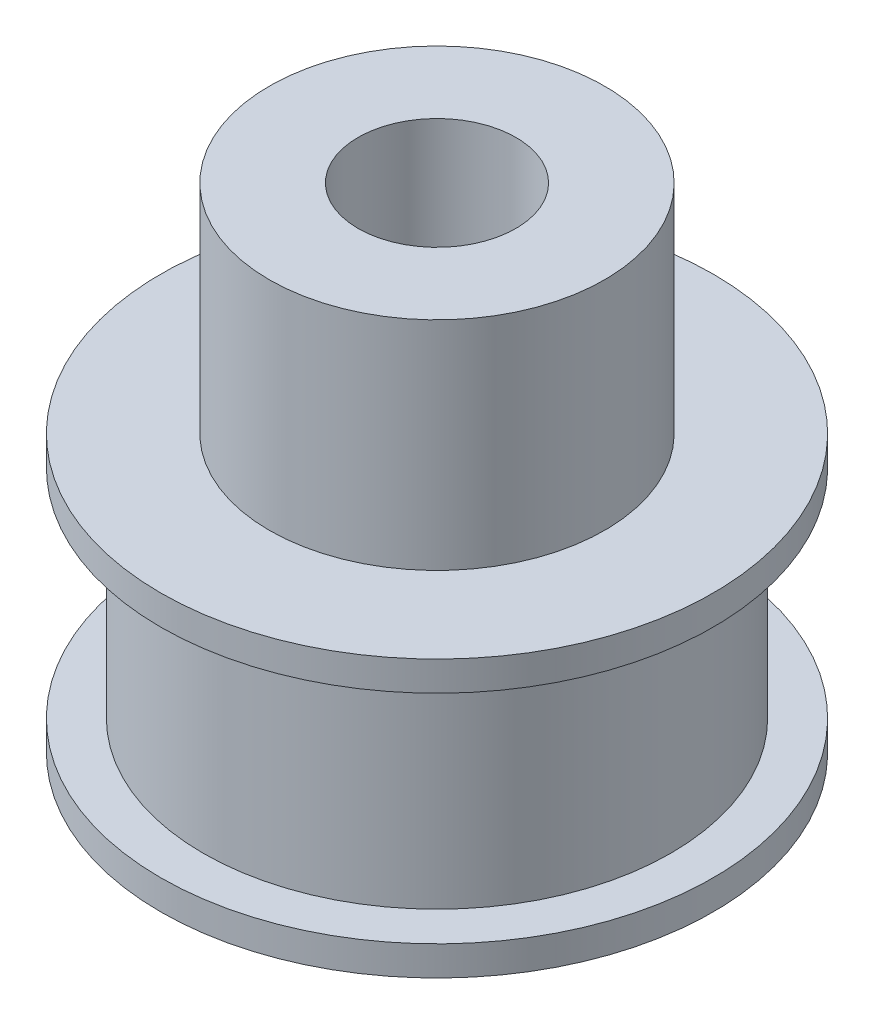
ISO-10303-21;
HEADER;
FILE_DESCRIPTION(('STEP AP214'),'2;1');
FILE_NAME('part.step','',(''),(''),'','','');
FILE_SCHEMA(('AUTOMOTIVE_DESIGN { 1 0 10303 214 1 1 1 1 }'));
ENDSEC;
DATA;
#1=APPLICATION_CONTEXT('core data for automotive mechanical design processes');
#2=APPLICATION_PROTOCOL_DEFINITION('international standard','automotive_design',2000,#1);
#3=PRODUCT_CONTEXT('',#1,'mechanical');
#4=PRODUCT('Part','Part','',(#3));
#5=PRODUCT_RELATED_PRODUCT_CATEGORY('part','',(#4));
#6=PRODUCT_DEFINITION_FORMATION('','',#4);
#7=PRODUCT_DEFINITION_CONTEXT('part definition',#1,'design');
#8=PRODUCT_DEFINITION('design','',#6,#7);
#9=PRODUCT_DEFINITION_SHAPE('','',#8);
#10=(LENGTH_UNIT() NAMED_UNIT(*) SI_UNIT(.MILLI.,.METRE.));
#11=(NAMED_UNIT(*) PLANE_ANGLE_UNIT() SI_UNIT($,.RADIAN.));
#12=(NAMED_UNIT(*) SI_UNIT($,.STERADIAN.) SOLID_ANGLE_UNIT());
#13=UNCERTAINTY_MEASURE_WITH_UNIT(LENGTH_MEASURE(1.E-05),#10,'distance_accuracy_value','');
#14=(GEOMETRIC_REPRESENTATION_CONTEXT(3) GLOBAL_UNCERTAINTY_ASSIGNED_CONTEXT((#13)) GLOBAL_UNIT_ASSIGNED_CONTEXT((#10,
#11,#12)) REPRESENTATION_CONTEXT('',''));
#15=CARTESIAN_POINT('',(0.,0.,0.));
#16=DIRECTION('',(0.,0.,1.));
#17=DIRECTION('',(1.,0.,0.));
#18=AXIS2_PLACEMENT_3D('',#15,#16,#17);
#19=CARTESIAN_POINT('',(0.,1.5,0.));
#20=DIRECTION('',(0.,-1.,0.));
#21=DIRECTION('',(0.,0.,-1.));
#22=AXIS2_PLACEMENT_3D('',#19,#20,#21);
#23=CYLINDRICAL_SURFACE('',#22,14.);
#24=CARTESIAN_POINT('',(0.,1.5,0.));
#25=DIRECTION('',(0.,1.,0.));
#26=DIRECTION('',(0.,0.,1.));
#27=AXIS2_PLACEMENT_3D('',#24,#25,#26);
#28=CIRCLE('',#27,14.);
#29=CARTESIAN_POINT('',(0.,1.5,14.));
#30=VERTEX_POINT('',#29);
#31=EDGE_CURVE('E10',#30,#30,#28,.T.);
#32=ORIENTED_EDGE('',*,*,#31,.F.);
#33=EDGE_LOOP('',(#32));
#34=FACE_BOUND('',#33,.T.);
#35=CARTESIAN_POINT('',(0.,0.,0.));
#36=DIRECTION('',(0.,1.,0.));
#37=DIRECTION('',(0.,0.,1.));
#38=AXIS2_PLACEMENT_3D('',#35,#36,#37);
#39=CIRCLE('',#38,14.);
#40=CARTESIAN_POINT('',(0.,0.,14.));
#41=VERTEX_POINT('',#40);
#42=EDGE_CURVE('E33',#41,#41,#39,.T.);
#43=ORIENTED_EDGE('',*,*,#42,.T.);
#44=EDGE_LOOP('',(#43));
#45=FACE_BOUND('',#44,.T.);
#46=ADVANCED_FACE('F30',(#34,#45),#23,.T.);
#47=CARTESIAN_POINT('',(0.,1.5,0.));
#48=DIRECTION('',(0.,1.,0.));
#49=DIRECTION('',(0.,0.,1.));
#50=AXIS2_PLACEMENT_3D('',#47,#48,#49);
#51=PLANE('',#50);
#52=CARTESIAN_POINT('',(0.,1.5,0.));
#53=DIRECTION('',(0.,1.,0.));
#54=DIRECTION('',(0.,0.,1.));
#55=AXIS2_PLACEMENT_3D('',#52,#53,#54);
#56=CIRCLE('',#55,11.85);
#57=CARTESIAN_POINT('',(0.,1.5,11.85));
#58=VERTEX_POINT('',#57);
#59=EDGE_CURVE('E42',#58,#58,#56,.T.);
#60=ORIENTED_EDGE('',*,*,#59,.F.);
#61=EDGE_LOOP('',(#60));
#62=FACE_BOUND('',#61,.T.);
#63=ORIENTED_EDGE('',*,*,#31,.T.);
#64=EDGE_LOOP('',(#63));
#65=FACE_BOUND('',#64,.T.);
#66=ADVANCED_FACE('F107',(#62,#65),#51,.T.);
#67=CARTESIAN_POINT('',(0.,0.,0.));
#68=DIRECTION('',(0.,1.,0.));
#69=DIRECTION('',(0.,0.,1.));
#70=AXIS2_PLACEMENT_3D('',#67,#68,#69);
#71=PLANE('',#70);
#72=CARTESIAN_POINT('',(0.,0.,0.));
#73=DIRECTION('',(0.,1.,0.));
#74=DIRECTION('',(0.,0.,1.));
#75=AXIS2_PLACEMENT_3D('',#72,#73,#74);
#76=CIRCLE('',#75,4.);
#77=CARTESIAN_POINT('',(0.,0.,4.));
#78=VERTEX_POINT('',#77);
#79=EDGE_CURVE('E57',#78,#78,#76,.T.);
#80=ORIENTED_EDGE('',*,*,#79,.T.);
#81=EDGE_LOOP('',(#80));
#82=FACE_BOUND('',#81,.T.);
#83=ORIENTED_EDGE('',*,*,#42,.F.);
#84=EDGE_LOOP('',(#83));
#85=FACE_BOUND('',#84,.T.);
#86=ADVANCED_FACE('F66',(#82,#85),#71,.F.);
#87=CARTESIAN_POINT('',(0.,12.5,0.));
#88=DIRECTION('',(0.,-1.,0.));
#89=DIRECTION('',(0.,0.,-1.));
#90=AXIS2_PLACEMENT_3D('',#87,#88,#89);
#91=CYLINDRICAL_SURFACE('',#90,11.85);
#92=CARTESIAN_POINT('',(0.,12.5,0.));
#93=DIRECTION('',(0.,1.,0.));
#94=DIRECTION('',(0.,0.,1.));
#95=AXIS2_PLACEMENT_3D('',#92,#93,#94);
#96=CIRCLE('',#95,11.85);
#97=CARTESIAN_POINT('',(0.,12.5,11.85));
#98=VERTEX_POINT('',#97);
#99=EDGE_CURVE('E40',#98,#98,#96,.T.);
#100=ORIENTED_EDGE('',*,*,#99,.F.);
#101=EDGE_LOOP('',(#100));
#102=FACE_BOUND('',#101,.T.);
#103=ORIENTED_EDGE('',*,*,#59,.T.);
#104=EDGE_LOOP('',(#103));
#105=FACE_BOUND('',#104,.T.);
#106=ADVANCED_FACE('F97',(#102,#105),#91,.T.);
#107=CARTESIAN_POINT('',(0.,14.,0.));
#108=DIRECTION('',(0.,-1.,0.));
#109=DIRECTION('',(0.,0.,-1.));
#110=AXIS2_PLACEMENT_3D('',#107,#108,#109);
#111=CYLINDRICAL_SURFACE('',#110,14.);
#112=CARTESIAN_POINT('',(0.,14.,0.));
#113=DIRECTION('',(0.,1.,0.));
#114=DIRECTION('',(0.,0.,1.));
#115=AXIS2_PLACEMENT_3D('',#112,#113,#114);
#116=CIRCLE('',#115,14.);
#117=CARTESIAN_POINT('',(0.,14.,14.));
#118=VERTEX_POINT('',#117);
#119=EDGE_CURVE('E45',#118,#118,#116,.T.);
#120=ORIENTED_EDGE('',*,*,#119,.F.);
#121=EDGE_LOOP('',(#120));
#122=FACE_BOUND('',#121,.T.);
#123=CARTESIAN_POINT('',(0.,12.5,0.));
#124=DIRECTION('',(0.,1.,0.));
#125=DIRECTION('',(0.,0.,1.));
#126=AXIS2_PLACEMENT_3D('',#123,#124,#125);
#127=CIRCLE('',#126,14.);
#128=CARTESIAN_POINT('',(0.,12.5,14.));
#129=VERTEX_POINT('',#128);
#130=EDGE_CURVE('E48',#129,#129,#127,.T.);
#131=ORIENTED_EDGE('',*,*,#130,.T.);
#132=EDGE_LOOP('',(#131));
#133=FACE_BOUND('',#132,.T.);
#134=ADVANCED_FACE('F91',(#122,#133),#111,.T.);
#135=CARTESIAN_POINT('',(0.,14.,0.));
#136=DIRECTION('',(0.,1.,0.));
#137=DIRECTION('',(0.,0.,1.));
#138=AXIS2_PLACEMENT_3D('',#135,#136,#137);
#139=PLANE('',#138);
#140=CARTESIAN_POINT('',(0.,14.,0.));
#141=DIRECTION('',(0.,1.,0.));
#142=DIRECTION('',(0.,0.,1.));
#143=AXIS2_PLACEMENT_3D('',#140,#141,#142);
#144=CIRCLE('',#143,8.5);
#145=CARTESIAN_POINT('',(0.,14.,8.5));
#146=VERTEX_POINT('',#145);
#147=EDGE_CURVE('E54',#146,#146,#144,.T.);
#148=ORIENTED_EDGE('',*,*,#147,.F.);
#149=EDGE_LOOP('',(#148));
#150=FACE_BOUND('',#149,.T.);
#151=ORIENTED_EDGE('',*,*,#119,.T.);
#152=EDGE_LOOP('',(#151));
#153=FACE_BOUND('',#152,.T.);
#154=ADVANCED_FACE('F88',(#150,#153),#139,.T.);
#155=CARTESIAN_POINT('',(0.,12.5,0.));
#156=DIRECTION('',(0.,1.,0.));
#157=DIRECTION('',(0.,0.,1.));
#158=AXIS2_PLACEMENT_3D('',#155,#156,#157);
#159=PLANE('',#158);
#160=ORIENTED_EDGE('',*,*,#99,.T.);
#161=EDGE_LOOP('',(#160));
#162=FACE_BOUND('',#161,.T.);
#163=ORIENTED_EDGE('',*,*,#130,.F.);
#164=EDGE_LOOP('',(#163));
#165=FACE_BOUND('',#164,.T.);
#166=ADVANCED_FACE('F84',(#162,#165),#159,.F.);
#167=CARTESIAN_POINT('',(0.,25.,0.));
#168=DIRECTION('',(0.,-1.,0.));
#169=DIRECTION('',(0.,0.,-1.));
#170=AXIS2_PLACEMENT_3D('',#167,#168,#169);
#171=CYLINDRICAL_SURFACE('',#170,8.5);
#172=CARTESIAN_POINT('',(0.,25.,0.));
#173=DIRECTION('',(0.,1.,0.));
#174=DIRECTION('',(0.,0.,1.));
#175=AXIS2_PLACEMENT_3D('',#172,#173,#174);
#176=CIRCLE('',#175,8.5);
#177=CARTESIAN_POINT('',(0.,25.,8.5));
#178=VERTEX_POINT('',#177);
#179=EDGE_CURVE('E51',#178,#178,#176,.T.);
#180=ORIENTED_EDGE('',*,*,#179,.F.);
#181=EDGE_LOOP('',(#180));
#182=FACE_BOUND('',#181,.T.);
#183=ORIENTED_EDGE('',*,*,#147,.T.);
#184=EDGE_LOOP('',(#183));
#185=FACE_BOUND('',#184,.T.);
#186=ADVANCED_FACE('F78',(#182,#185),#171,.T.);
#187=CARTESIAN_POINT('',(0.,25.,0.));
#188=DIRECTION('',(0.,1.,0.));
#189=DIRECTION('',(0.,0.,1.));
#190=AXIS2_PLACEMENT_3D('',#187,#188,#189);
#191=PLANE('',#190);
#192=CARTESIAN_POINT('',(0.,25.,0.));
#193=DIRECTION('',(0.,1.,0.));
#194=DIRECTION('',(0.,0.,1.));
#195=AXIS2_PLACEMENT_3D('',#192,#193,#194);
#196=CIRCLE('',#195,4.);
#197=CARTESIAN_POINT('',(0.,25.,4.));
#198=VERTEX_POINT('',#197);
#199=EDGE_CURVE('E60',#198,#198,#196,.T.);
#200=ORIENTED_EDGE('',*,*,#199,.F.);
#201=EDGE_LOOP('',(#200));
#202=FACE_BOUND('',#201,.T.);
#203=ORIENTED_EDGE('',*,*,#179,.T.);
#204=EDGE_LOOP('',(#203));
#205=FACE_BOUND('',#204,.T.);
#206=ADVANCED_FACE('F72',(#202,#205),#191,.T.);
#207=CARTESIAN_POINT('',(0.,0.,0.));
#208=DIRECTION('',(0.,1.,0.));
#209=DIRECTION('',(0.,0.,1.));
#210=AXIS2_PLACEMENT_3D('',#207,#208,#209);
#211=CYLINDRICAL_SURFACE('',#210,4.);
#212=CARTESIAN_POINT('',(0.,0.,4.));
#213=CARTESIAN_POINT('',(0.,0.260416666666666,4.));
#214=CARTESIAN_POINT('',(0.,0.520833333333333,4.));
#215=CARTESIAN_POINT('',(0.,1.04166666666667,4.));
#216=CARTESIAN_POINT('',(0.,1.30208333333333,4.));
#217=CARTESIAN_POINT('',(0.,1.82291666666667,4.));
#218=CARTESIAN_POINT('',(0.,2.08333333333333,4.));
#219=CARTESIAN_POINT('',(0.,2.60416666666667,4.));
#220=CARTESIAN_POINT('',(0.,2.86458333333333,4.));
#221=CARTESIAN_POINT('',(0.,3.38541666666667,4.));
#222=CARTESIAN_POINT('',(0.,3.64583333333333,4.));
#223=CARTESIAN_POINT('',(0.,4.16666666666667,4.));
#224=CARTESIAN_POINT('',(0.,4.42708333333333,4.));
#225=CARTESIAN_POINT('',(0.,4.94791666666667,4.));
#226=CARTESIAN_POINT('',(0.,5.20833333333333,4.));
#227=CARTESIAN_POINT('',(0.,5.72916666666667,4.));
#228=CARTESIAN_POINT('',(0.,5.98958333333333,4.));
#229=CARTESIAN_POINT('',(0.,6.51041666666667,4.));
#230=CARTESIAN_POINT('',(0.,6.77083333333333,4.));
#231=CARTESIAN_POINT('',(0.,7.29166666666667,4.));
#232=CARTESIAN_POINT('',(0.,7.55208333333333,4.));
#233=CARTESIAN_POINT('',(0.,8.07291666666667,4.));
#234=CARTESIAN_POINT('',(0.,8.33333333333333,4.));
#235=CARTESIAN_POINT('',(0.,8.85416666666667,4.));
#236=CARTESIAN_POINT('',(0.,9.11458333333333,4.));
#237=CARTESIAN_POINT('',(0.,9.63541666666667,4.));
#238=CARTESIAN_POINT('',(0.,9.89583333333333,4.));
#239=CARTESIAN_POINT('',(0.,10.4166666666667,4.));
#240=CARTESIAN_POINT('',(0.,10.6770833333333,4.));
#241=CARTESIAN_POINT('',(0.,11.1979166666667,4.));
#242=CARTESIAN_POINT('',(0.,11.4583333333333,4.));
#243=CARTESIAN_POINT('',(0.,11.9791666666667,4.));
#244=CARTESIAN_POINT('',(0.,12.2395833333333,4.));
#245=CARTESIAN_POINT('',(0.,12.7604166666667,4.));
#246=CARTESIAN_POINT('',(0.,13.0208333333333,4.));
#247=CARTESIAN_POINT('',(0.,13.5416666666667,4.));
#248=CARTESIAN_POINT('',(0.,13.8020833333333,4.));
#249=CARTESIAN_POINT('',(0.,14.3229166666667,4.));
#250=CARTESIAN_POINT('',(0.,14.5833333333333,4.));
#251=CARTESIAN_POINT('',(0.,15.1041666666667,4.));
#252=CARTESIAN_POINT('',(0.,15.3645833333333,4.));
#253=CARTESIAN_POINT('',(0.,15.8854166666667,4.));
#254=CARTESIAN_POINT('',(0.,16.1458333333333,4.));
#255=CARTESIAN_POINT('',(0.,16.6666666666667,4.));
#256=CARTESIAN_POINT('',(0.,16.9270833333333,4.));
#257=CARTESIAN_POINT('',(0.,17.4479166666667,4.));
#258=CARTESIAN_POINT('',(0.,17.7083333333333,4.));
#259=CARTESIAN_POINT('',(0.,18.2291666666667,4.));
#260=CARTESIAN_POINT('',(0.,18.4895833333333,4.));
#261=CARTESIAN_POINT('',(0.,19.0104166666667,4.));
#262=CARTESIAN_POINT('',(0.,19.2708333333333,4.));
#263=CARTESIAN_POINT('',(0.,19.7916666666667,4.));
#264=CARTESIAN_POINT('',(0.,20.0520833333333,4.));
#265=CARTESIAN_POINT('',(0.,20.5729166666667,4.));
#266=CARTESIAN_POINT('',(0.,20.8333333333333,4.));
#267=CARTESIAN_POINT('',(0.,21.3541666666667,4.));
#268=CARTESIAN_POINT('',(0.,21.6145833333333,4.));
#269=CARTESIAN_POINT('',(0.,22.1354166666667,4.));
#270=CARTESIAN_POINT('',(0.,22.3958333333333,4.));
#271=CARTESIAN_POINT('',(0.,22.9166666666667,4.));
#272=CARTESIAN_POINT('',(0.,23.1770833333333,4.));
#273=CARTESIAN_POINT('',(0.,23.6979166666667,4.));
#274=CARTESIAN_POINT('',(0.,23.9583333333333,4.));
#275=CARTESIAN_POINT('',(0.,24.4791666666667,4.));
#276=CARTESIAN_POINT('',(0.,24.7395833333333,4.));
#277=CARTESIAN_POINT('',(0.,25.,4.));
#278=B_SPLINE_CURVE_WITH_KNOTS('',3,(#212,#213,#214,#215,#216,#217,#218,#219,#220,#221,#222,
#223,#224,#225,#226,#227,#228,#229,#230,#231,#232,#233,#234,#235,#236,#237,#238,#239,#240,#241,
#242,#243,#244,#245,#246,#247,#248,#249,#250,#251,#252,#253,#254,#255,#256,#257,#258,#259,#260,
#261,#262,#263,#264,#265,#266,#267,#268,#269,#270,#271,#272,#273,#274,#275,#276,#277),
.UNSPECIFIED.,.F.,.F.,(4,2,2,2,2,2,2,2,2,2,2,2,2,2,2,2,2,2,2,2,2,2,2,2,2,2,2,2,2,2,2,2,4),(0.,
0.78125,1.5625,2.34375,3.125,3.90625,4.6875,5.46875,6.25,7.03125,7.8125,8.59375,9.375,10.15625,
10.9375,11.71875,12.5,13.28125,14.0625,14.84375,15.625,16.40625,17.1875,17.96875,18.75,19.53125,
20.3125,21.09375,21.875,22.65625,23.4375,24.21875,25.),.UNSPECIFIED.);
#279=EDGE_CURVE('BSEAM69',#78,#198,#278,.T.);
#280=ORIENTED_EDGE('',*,*,#79,.F.);
#281=ORIENTED_EDGE('',*,*,#199,.T.);
#282=ORIENTED_EDGE('',*,*,#279,.T.);
#283=ORIENTED_EDGE('',*,*,#279,.F.);
#284=EDGE_LOOP('',(#280,#282,#281,#283));
#285=FACE_BOUND('',#284,.T.);
#286=ADVANCED_FACE('F69',(#285),#211,.F.);
#287=CLOSED_SHELL('',(#46,#66,#86,#106,#134,#154,#166,#186,#206,#286));
#288=MANIFOLD_SOLID_BREP('B2',#287);
#289=ADVANCED_BREP_SHAPE_REPRESENTATION('',(#18,#288),#14);
#290=SHAPE_DEFINITION_REPRESENTATION(#9,#289);
ENDSEC;
END-ISO-10303-21;
